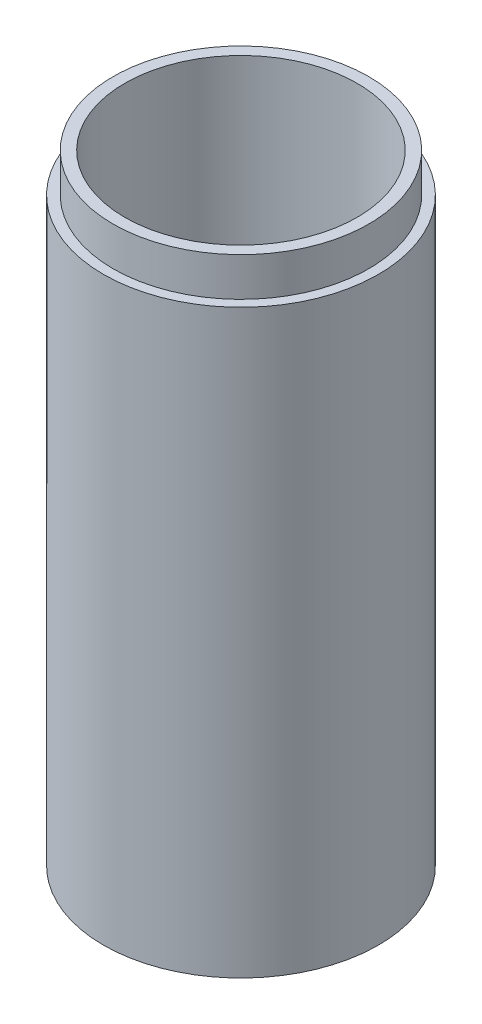
ISO-10303-21;
HEADER;
FILE_DESCRIPTION(('STEP AP214'),'2;1');
FILE_NAME('part.step','',(''),(''),'','','');
FILE_SCHEMA(('AUTOMOTIVE_DESIGN { 1 0 10303 214 1 1 1 1 }'));
ENDSEC;
DATA;
#1=APPLICATION_CONTEXT('core data for automotive mechanical design processes');
#2=APPLICATION_PROTOCOL_DEFINITION('international standard','automotive_design',2000,#1);
#3=PRODUCT_CONTEXT('',#1,'mechanical');
#4=PRODUCT('Part','Part','',(#3));
#5=PRODUCT_RELATED_PRODUCT_CATEGORY('part','',(#4));
#6=PRODUCT_DEFINITION_FORMATION('','',#4);
#7=PRODUCT_DEFINITION_CONTEXT('part definition',#1,'design');
#8=PRODUCT_DEFINITION('design','',#6,#7);
#9=PRODUCT_DEFINITION_SHAPE('','',#8);
#10=(LENGTH_UNIT() NAMED_UNIT(*) SI_UNIT(.MILLI.,.METRE.));
#11=(NAMED_UNIT(*) PLANE_ANGLE_UNIT() SI_UNIT($,.RADIAN.));
#12=(NAMED_UNIT(*) SI_UNIT($,.STERADIAN.) SOLID_ANGLE_UNIT());
#13=UNCERTAINTY_MEASURE_WITH_UNIT(LENGTH_MEASURE(1.E-05),#10,'distance_accuracy_value','');
#14=(GEOMETRIC_REPRESENTATION_CONTEXT(3) GLOBAL_UNCERTAINTY_ASSIGNED_CONTEXT((#13)) GLOBAL_UNIT_ASSIGNED_CONTEXT((#10,
#11,#12)) REPRESENTATION_CONTEXT('',''));
#15=CARTESIAN_POINT('',(0.,0.,0.));
#16=DIRECTION('',(0.,0.,1.));
#17=DIRECTION('',(1.,0.,0.));
#18=AXIS2_PLACEMENT_3D('',#15,#16,#17);
#19=CARTESIAN_POINT('',(0.,75.,0.));
#20=DIRECTION('',(0.,1.,0.));
#21=DIRECTION('',(0.,0.,1.));
#22=AXIS2_PLACEMENT_3D('',#19,#20,#21);
#23=PLANE('',#22);
#24=CARTESIAN_POINT('',(0.,75.,0.));
#25=DIRECTION('',(0.,1.,0.));
#26=DIRECTION('',(0.,0.,1.));
#27=AXIS2_PLACEMENT_3D('',#24,#25,#26);
#28=CIRCLE('',#27,17.7499999999995);
#29=CARTESIAN_POINT('',(0.,75.,17.7499999999995));
#30=VERTEX_POINT('',#29);
#31=EDGE_CURVE('E10',#30,#30,#28,.T.);
#32=ORIENTED_EDGE('',*,*,#31,.T.);
#33=EDGE_LOOP('',(#32));
#34=FACE_BOUND('',#33,.T.);
#35=CARTESIAN_POINT('',(0.,75.,0.));
#36=DIRECTION('',(0.,1.,0.));
#37=DIRECTION('',(0.,0.,1.));
#38=AXIS2_PLACEMENT_3D('',#35,#36,#37);
#39=CIRCLE('',#38,16.5);
#40=CARTESIAN_POINT('',(0.,75.,16.5));
#41=VERTEX_POINT('',#40);
#42=EDGE_CURVE('E49',#41,#41,#39,.T.);
#43=ORIENTED_EDGE('',*,*,#42,.F.);
#44=EDGE_LOOP('',(#43));
#45=FACE_BOUND('',#44,.T.);
#46=ADVANCED_FACE('F33',(#34,#45),#23,.T.);
#47=CARTESIAN_POINT('',(0.,0.,0.));
#48=DIRECTION('',(0.,1.,0.));
#49=DIRECTION('',(0.,0.,1.));
#50=AXIS2_PLACEMENT_3D('',#47,#48,#49);
#51=PLANE('',#50);
#52=CARTESIAN_POINT('',(0.,0.,0.));
#53=DIRECTION('',(0.,1.,0.));
#54=DIRECTION('',(0.,0.,1.));
#55=AXIS2_PLACEMENT_3D('',#52,#53,#54);
#56=CIRCLE('',#55,17.7499999999995);
#57=CARTESIAN_POINT('',(0.,0.,17.7499999999995));
#58=VERTEX_POINT('',#57);
#59=EDGE_CURVE('E37',#58,#58,#56,.T.);
#60=ORIENTED_EDGE('',*,*,#59,.F.);
#61=EDGE_LOOP('',(#60));
#62=FACE_BOUND('',#61,.T.);
#63=CARTESIAN_POINT('',(0.,0.,0.));
#64=DIRECTION('',(0.,1.,0.));
#65=DIRECTION('',(0.,0.,1.));
#66=AXIS2_PLACEMENT_3D('',#63,#64,#65);
#67=CIRCLE('',#66,15.);
#68=CARTESIAN_POINT('',(0.,0.,15.));
#69=VERTEX_POINT('',#68);
#70=EDGE_CURVE('E44',#69,#69,#67,.T.);
#71=ORIENTED_EDGE('',*,*,#70,.T.);
#72=EDGE_LOOP('',(#71));
#73=FACE_BOUND('',#72,.T.);
#74=ADVANCED_FACE('F74',(#62,#73),#51,.F.);
#75=CARTESIAN_POINT('',(0.,75.,0.));
#76=DIRECTION('',(0.,-1.,0.));
#77=DIRECTION('',(0.,0.,-1.));
#78=AXIS2_PLACEMENT_3D('',#75,#76,#77);
#79=CYLINDRICAL_SURFACE('',#78,17.7499999999995);
#80=ORIENTED_EDGE('',*,*,#31,.F.);
#81=EDGE_LOOP('',(#80));
#82=FACE_BOUND('',#81,.T.);
#83=ORIENTED_EDGE('',*,*,#59,.T.);
#84=EDGE_LOOP('',(#83));
#85=FACE_BOUND('',#84,.T.);
#86=ADVANCED_FACE('F35',(#82,#85),#79,.T.);
#87=CARTESIAN_POINT('',(0.,75.,0.));
#88=DIRECTION('',(0.,-1.,0.));
#89=DIRECTION('',(0.,0.,-1.));
#90=AXIS2_PLACEMENT_3D('',#87,#88,#89);
#91=CYLINDRICAL_SURFACE('',#90,15.);
#92=ORIENTED_EDGE('',*,*,#70,.F.);
#93=EDGE_LOOP('',(#92));
#94=FACE_BOUND('',#93,.T.);
#95=CARTESIAN_POINT('',(0.,80.,0.));
#96=DIRECTION('',(0.,1.,0.));
#97=DIRECTION('',(0.,0.,1.));
#98=AXIS2_PLACEMENT_3D('',#95,#96,#97);
#99=CIRCLE('',#98,15.);
#100=CARTESIAN_POINT('',(0.,80.,15.));
#101=VERTEX_POINT('',#100);
#102=EDGE_CURVE('E52',#101,#101,#99,.T.);
#103=ORIENTED_EDGE('',*,*,#102,.T.);
#104=EDGE_LOOP('',(#103));
#105=FACE_BOUND('',#104,.T.);
#106=ADVANCED_FACE('F58',(#94,#105),#91,.F.);
#107=CARTESIAN_POINT('',(0.,80.,0.));
#108=DIRECTION('',(0.,1.,0.));
#109=DIRECTION('',(0.,0.,1.));
#110=AXIS2_PLACEMENT_3D('',#107,#108,#109);
#111=PLANE('',#110);
#112=CARTESIAN_POINT('',(0.,80.,0.));
#113=DIRECTION('',(0.,1.,0.));
#114=DIRECTION('',(0.,0.,1.));
#115=AXIS2_PLACEMENT_3D('',#112,#113,#114);
#116=CIRCLE('',#115,16.5);
#117=CARTESIAN_POINT('',(0.,80.,16.5));
#118=VERTEX_POINT('',#117);
#119=EDGE_CURVE('E48',#118,#118,#116,.T.);
#120=ORIENTED_EDGE('',*,*,#119,.T.);
#121=EDGE_LOOP('',(#120));
#122=FACE_BOUND('',#121,.T.);
#123=ORIENTED_EDGE('',*,*,#102,.F.);
#124=EDGE_LOOP('',(#123));
#125=FACE_BOUND('',#124,.T.);
#126=ADVANCED_FACE('F60',(#122,#125),#111,.T.);
#127=CARTESIAN_POINT('',(0.,80.,0.));
#128=DIRECTION('',(0.,-1.,0.));
#129=DIRECTION('',(0.,0.,-1.));
#130=AXIS2_PLACEMENT_3D('',#127,#128,#129);
#131=CYLINDRICAL_SURFACE('',#130,16.5);
#132=ORIENTED_EDGE('',*,*,#119,.F.);
#133=EDGE_LOOP('',(#132));
#134=FACE_BOUND('',#133,.T.);
#135=ORIENTED_EDGE('',*,*,#42,.T.);
#136=EDGE_LOOP('',(#135));
#137=FACE_BOUND('',#136,.T.);
#138=ADVANCED_FACE('F62',(#134,#137),#131,.T.);
#139=CLOSED_SHELL('',(#46,#74,#86,#106,#126,#138));
#140=MANIFOLD_SOLID_BREP('B2',#139);
#141=ADVANCED_BREP_SHAPE_REPRESENTATION('',(#18,#140),#14);
#142=SHAPE_DEFINITION_REPRESENTATION(#9,#141);
ENDSEC;
END-ISO-10303-21;
